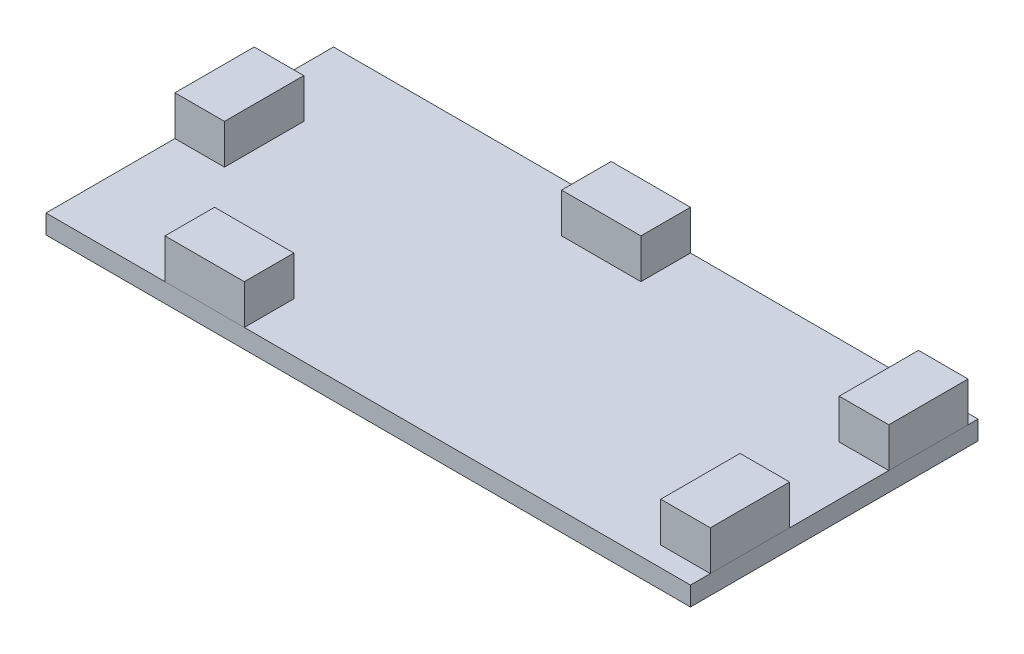
ISO-10303-21;
HEADER;
FILE_DESCRIPTION(('STEP AP214'),'2;1');
FILE_NAME('part.step','',(''),(''),'','','');
FILE_SCHEMA(('AUTOMOTIVE_DESIGN { 1 0 10303 214 1 1 1 1 }'));
ENDSEC;
DATA;
#1=APPLICATION_CONTEXT('core data for automotive mechanical design processes');
#2=APPLICATION_PROTOCOL_DEFINITION('international standard','automotive_design',2000,#1);
#3=PRODUCT_CONTEXT('',#1,'mechanical');
#4=PRODUCT('Part','Part','',(#3));
#5=PRODUCT_RELATED_PRODUCT_CATEGORY('part','',(#4));
#6=PRODUCT_DEFINITION_FORMATION('','',#4);
#7=PRODUCT_DEFINITION_CONTEXT('part definition',#1,'design');
#8=PRODUCT_DEFINITION('design','',#6,#7);
#9=PRODUCT_DEFINITION_SHAPE('','',#8);
#10=(LENGTH_UNIT() NAMED_UNIT(*) SI_UNIT(.MILLI.,.METRE.));
#11=(NAMED_UNIT(*) PLANE_ANGLE_UNIT() SI_UNIT($,.RADIAN.));
#12=(NAMED_UNIT(*) SI_UNIT($,.STERADIAN.) SOLID_ANGLE_UNIT());
#13=UNCERTAINTY_MEASURE_WITH_UNIT(LENGTH_MEASURE(1.E-05),#10,'distance_accuracy_value','');
#14=(GEOMETRIC_REPRESENTATION_CONTEXT(3) GLOBAL_UNCERTAINTY_ASSIGNED_CONTEXT((#13)) GLOBAL_UNIT_ASSIGNED_CONTEXT((#10,
#11,#12)) REPRESENTATION_CONTEXT('',''));
#15=CARTESIAN_POINT('',(0.,0.,0.));
#16=DIRECTION('',(0.,0.,1.));
#17=DIRECTION('',(1.,0.,0.));
#18=AXIS2_PLACEMENT_3D('',#15,#16,#17);
#19=CARTESIAN_POINT('',(-16.271875,4.699,11.509375));
#20=DIRECTION('',(1.,0.,0.));
#21=DIRECTION('',(0.,0.,-1.));
#22=AXIS2_PLACEMENT_3D('',#19,#20,#21);
#23=PLANE('',#22);
#24=DIRECTION('',(0.,0.,1.));
#25=VECTOR('',#24,1.);
#26=CARTESIAN_POINT('',(-16.271875,1.524,11.509375));
#27=LINE('',#26,#25);
#28=CARTESIAN_POINT('',(-16.271875,1.524,7.540625));
#29=VERTEX_POINT('',#28);
#30=CARTESIAN_POINT('',(-16.271875,1.524,11.509375));
#31=VERTEX_POINT('',#30);
#32=EDGE_CURVE('E106',#29,#31,#27,.T.);
#33=ORIENTED_EDGE('',*,*,#32,.T.);
#34=DIRECTION('',(0.,-1.,0.));
#35=VECTOR('',#34,1.);
#36=CARTESIAN_POINT('',(-16.271875,4.699,11.509375));
#37=LINE('',#36,#35);
#38=CARTESIAN_POINT('',(-16.271875,4.699,11.509375));
#39=VERTEX_POINT('',#38);
#40=EDGE_CURVE('E12',#39,#31,#37,.T.);
#41=ORIENTED_EDGE('',*,*,#40,.F.);
#42=DIRECTION('',(0.,0.,1.));
#43=VECTOR('',#42,1.);
#44=CARTESIAN_POINT('',(-16.271875,4.699,11.509375));
#45=LINE('',#44,#43);
#46=CARTESIAN_POINT('',(-16.271875,4.699,7.540625));
#47=VERTEX_POINT('',#46);
#48=EDGE_CURVE('E94',#47,#39,#45,.T.);
#49=ORIENTED_EDGE('',*,*,#48,.F.);
#50=DIRECTION('',(0.,-1.,0.));
#51=VECTOR('',#50,1.);
#52=CARTESIAN_POINT('',(-16.271875,4.699,7.540625));
#53=LINE('',#52,#51);
#54=EDGE_CURVE('E102',#47,#29,#53,.T.);
#55=ORIENTED_EDGE('',*,*,#54,.T.);
#56=EDGE_LOOP('',(#33,#41,#49,#55));
#57=FACE_BOUND('',#56,.T.);
#58=ADVANCED_FACE('F43',(#57),#23,.F.);
#59=CARTESIAN_POINT('',(-16.271875,4.699,11.509375));
#60=DIRECTION('',(0.,0.,-1.));
#61=DIRECTION('',(-1.,0.,0.));
#62=AXIS2_PLACEMENT_3D('',#59,#60,#61);
#63=PLANE('',#62);
#64=DIRECTION('',(1.,0.,0.));
#65=VECTOR('',#64,1.);
#66=CARTESIAN_POINT('',(-16.271875,1.524,11.509375));
#67=LINE('',#66,#65);
#68=CARTESIAN_POINT('',(-9.921875,1.524,11.509375));
#69=VERTEX_POINT('',#68);
#70=EDGE_CURVE('E98',#31,#69,#67,.T.);
#71=ORIENTED_EDGE('',*,*,#70,.T.);
#72=DIRECTION('',(0.,-1.,0.));
#73=VECTOR('',#72,1.);
#74=CARTESIAN_POINT('',(-9.921875,4.699,11.509375));
#75=LINE('',#74,#73);
#76=CARTESIAN_POINT('',(-9.921875,4.699,11.509375));
#77=VERTEX_POINT('',#76);
#78=EDGE_CURVE('E51',#77,#69,#75,.T.);
#79=ORIENTED_EDGE('',*,*,#78,.F.);
#80=DIRECTION('',(1.,0.,0.));
#81=VECTOR('',#80,1.);
#82=CARTESIAN_POINT('',(-16.271875,4.699,11.509375));
#83=LINE('',#82,#81);
#84=EDGE_CURVE('E89',#39,#77,#83,.T.);
#85=ORIENTED_EDGE('',*,*,#84,.F.);
#86=ORIENTED_EDGE('',*,*,#40,.T.);
#87=EDGE_LOOP('',(#71,#79,#85,#86));
#88=FACE_BOUND('',#87,.T.);
#89=ADVANCED_FACE('F97',(#88),#63,.F.);
#90=CARTESIAN_POINT('',(-9.921875,4.699,11.509375));
#91=DIRECTION('',(-1.,0.,0.));
#92=DIRECTION('',(0.,0.,1.));
#93=AXIS2_PLACEMENT_3D('',#90,#91,#92);
#94=PLANE('',#93);
#95=DIRECTION('',(0.,0.,-1.));
#96=VECTOR('',#95,1.);
#97=CARTESIAN_POINT('',(-9.921875,1.524,11.509375));
#98=LINE('',#97,#96);
#99=CARTESIAN_POINT('',(-9.921875,1.524,7.540625));
#100=VERTEX_POINT('',#99);
#101=EDGE_CURVE('E76',#69,#100,#98,.T.);
#102=ORIENTED_EDGE('',*,*,#101,.T.);
#103=DIRECTION('',(0.,-1.,0.));
#104=VECTOR('',#103,1.);
#105=CARTESIAN_POINT('',(-9.921875,4.699,7.540625));
#106=LINE('',#105,#104);
#107=CARTESIAN_POINT('',(-9.921875,4.699,7.540625));
#108=VERTEX_POINT('',#107);
#109=EDGE_CURVE('E99',#108,#100,#106,.T.);
#110=ORIENTED_EDGE('',*,*,#109,.F.);
#111=DIRECTION('',(0.,0.,-1.));
#112=VECTOR('',#111,1.);
#113=CARTESIAN_POINT('',(-9.921875,4.699,11.509375));
#114=LINE('',#113,#112);
#115=EDGE_CURVE('E92',#77,#108,#114,.T.);
#116=ORIENTED_EDGE('',*,*,#115,.F.);
#117=ORIENTED_EDGE('',*,*,#78,.T.);
#118=EDGE_LOOP('',(#102,#110,#116,#117));
#119=FACE_BOUND('',#118,.T.);
#120=ADVANCED_FACE('F100',(#119),#94,.F.);
#121=CARTESIAN_POINT('',(-16.271875,4.699,7.540625));
#122=DIRECTION('',(0.,0.,1.));
#123=DIRECTION('',(1.,0.,0.));
#124=AXIS2_PLACEMENT_3D('',#121,#122,#123);
#125=PLANE('',#124);
#126=DIRECTION('',(-1.,0.,0.));
#127=VECTOR('',#126,1.);
#128=CARTESIAN_POINT('',(-16.271875,1.524,7.540625));
#129=LINE('',#128,#127);
#130=EDGE_CURVE('E82',#100,#29,#129,.T.);
#131=ORIENTED_EDGE('',*,*,#130,.T.);
#132=ORIENTED_EDGE('',*,*,#54,.F.);
#133=DIRECTION('',(-1.,0.,0.));
#134=VECTOR('',#133,1.);
#135=CARTESIAN_POINT('',(-16.271875,4.699,7.540625));
#136=LINE('',#135,#134);
#137=EDGE_CURVE('E59',#108,#47,#136,.T.);
#138=ORIENTED_EDGE('',*,*,#137,.F.);
#139=ORIENTED_EDGE('',*,*,#109,.T.);
#140=EDGE_LOOP('',(#131,#132,#138,#139));
#141=FACE_BOUND('',#140,.T.);
#142=ADVANCED_FACE('F113',(#141),#125,.F.);
#143=CARTESIAN_POINT('',(-16.271875,4.699,7.540625));
#144=DIRECTION('',(0.,-1.,0.));
#145=DIRECTION('',(0.,0.,-1.));
#146=AXIS2_PLACEMENT_3D('',#143,#144,#145);
#147=PLANE('',#146);
#148=ORIENTED_EDGE('',*,*,#48,.T.);
#149=ORIENTED_EDGE('',*,*,#84,.T.);
#150=ORIENTED_EDGE('',*,*,#115,.T.);
#151=ORIENTED_EDGE('',*,*,#137,.T.);
#152=EDGE_LOOP('',(#148,#149,#150,#151));
#153=FACE_BOUND('',#152,.T.);
#154=ADVANCED_FACE('F90',(#153),#147,.F.);
#155=CARTESIAN_POINT('',(-16.271875,1.524,7.540625));
#156=DIRECTION('',(0.,-1.,0.));
#157=DIRECTION('',(0.,0.,-1.));
#158=AXIS2_PLACEMENT_3D('',#155,#156,#157);
#159=PLANE('',#158);
#160=ORIENTED_EDGE('',*,*,#32,.F.);
#161=ORIENTED_EDGE('',*,*,#130,.F.);
#162=ORIENTED_EDGE('',*,*,#101,.F.);
#163=ORIENTED_EDGE('',*,*,#70,.F.);
#164=EDGE_LOOP('',(#160,#161,#162,#163));
#165=FACE_BOUND('',#164,.T.);
#166=ADVANCED_FACE('F116',(#165),#159,.T.);
#167=CLOSED_SHELL('',(#58,#89,#120,#142,#154,#166));
#168=MANIFOLD_SOLID_BREP('B2',#167);
#169=CARTESIAN_POINT('',(-25.796875,4.699,-5.159375));
#170=DIRECTION('',(1.,0.,0.));
#171=DIRECTION('',(0.,0.,-1.));
#172=AXIS2_PLACEMENT_3D('',#169,#170,#171);
#173=PLANE('',#172);
#174=DIRECTION('',(0.,0.,1.));
#175=VECTOR('',#174,1.);
#176=CARTESIAN_POINT('',(-25.796875,1.524,-5.159375));
#177=LINE('',#176,#175);
#178=CARTESIAN_POINT('',(-25.796875,1.524,-5.159375));
#179=VERTEX_POINT('',#178);
#180=CARTESIAN_POINT('',(-25.796875,1.524,1.190625));
#181=VERTEX_POINT('',#180);
#182=EDGE_CURVE('E239',#179,#181,#177,.T.);
#183=ORIENTED_EDGE('',*,*,#182,.T.);
#184=DIRECTION('',(0.,-1.,0.));
#185=VECTOR('',#184,1.);
#186=CARTESIAN_POINT('',(-25.796875,4.699,1.190625));
#187=LINE('',#186,#185);
#188=CARTESIAN_POINT('',(-25.796875,4.699,1.190625));
#189=VERTEX_POINT('',#188);
#190=EDGE_CURVE('E41',#189,#181,#187,.T.);
#191=ORIENTED_EDGE('',*,*,#190,.F.);
#192=DIRECTION('',(0.,0.,1.));
#193=VECTOR('',#192,1.);
#194=CARTESIAN_POINT('',(-25.796875,4.699,-5.159375));
#195=LINE('',#194,#193);
#196=CARTESIAN_POINT('',(-25.796875,4.699,-5.159375));
#197=VERTEX_POINT('',#196);
#198=EDGE_CURVE('E227',#197,#189,#195,.T.);
#199=ORIENTED_EDGE('',*,*,#198,.F.);
#200=DIRECTION('',(0.,-1.,0.));
#201=VECTOR('',#200,1.);
#202=CARTESIAN_POINT('',(-25.796875,4.699,-5.159375));
#203=LINE('',#202,#201);
#204=EDGE_CURVE('E235',#197,#179,#203,.T.);
#205=ORIENTED_EDGE('',*,*,#204,.T.);
#206=EDGE_LOOP('',(#183,#191,#199,#205));
#207=FACE_BOUND('',#206,.T.);
#208=ADVANCED_FACE('F176',(#207),#173,.F.);
#209=CARTESIAN_POINT('',(-25.796875,4.699,1.190625));
#210=DIRECTION('',(0.,0.,-1.));
#211=DIRECTION('',(-1.,0.,0.));
#212=AXIS2_PLACEMENT_3D('',#209,#210,#211);
#213=PLANE('',#212);
#214=DIRECTION('',(1.,0.,0.));
#215=VECTOR('',#214,1.);
#216=CARTESIAN_POINT('',(-25.796875,1.524,1.190625));
#217=LINE('',#216,#215);
#218=CARTESIAN_POINT('',(-21.828125,1.524,1.190625));
#219=VERTEX_POINT('',#218);
#220=EDGE_CURVE('E231',#181,#219,#217,.T.);
#221=ORIENTED_EDGE('',*,*,#220,.T.);
#222=DIRECTION('',(0.,-1.,0.));
#223=VECTOR('',#222,1.);
#224=CARTESIAN_POINT('',(-21.828125,4.699,1.190625));
#225=LINE('',#224,#223);
#226=CARTESIAN_POINT('',(-21.828125,4.699,1.190625));
#227=VERTEX_POINT('',#226);
#228=EDGE_CURVE('E184',#227,#219,#225,.T.);
#229=ORIENTED_EDGE('',*,*,#228,.F.);
#230=DIRECTION('',(1.,0.,0.));
#231=VECTOR('',#230,1.);
#232=CARTESIAN_POINT('',(-25.796875,4.699,1.190625));
#233=LINE('',#232,#231);
#234=EDGE_CURVE('E222',#189,#227,#233,.T.);
#235=ORIENTED_EDGE('',*,*,#234,.F.);
#236=ORIENTED_EDGE('',*,*,#190,.T.);
#237=EDGE_LOOP('',(#221,#229,#235,#236));
#238=FACE_BOUND('',#237,.T.);
#239=ADVANCED_FACE('F230',(#238),#213,.F.);
#240=CARTESIAN_POINT('',(-21.828125,4.699,-5.159375));
#241=DIRECTION('',(-1.,0.,0.));
#242=DIRECTION('',(0.,0.,1.));
#243=AXIS2_PLACEMENT_3D('',#240,#241,#242);
#244=PLANE('',#243);
#245=DIRECTION('',(0.,0.,-1.));
#246=VECTOR('',#245,1.);
#247=CARTESIAN_POINT('',(-21.828125,1.524,-5.159375));
#248=LINE('',#247,#246);
#249=CARTESIAN_POINT('',(-21.828125,1.524,-5.159375));
#250=VERTEX_POINT('',#249);
#251=EDGE_CURVE('E209',#219,#250,#248,.T.);
#252=ORIENTED_EDGE('',*,*,#251,.T.);
#253=DIRECTION('',(0.,-1.,0.));
#254=VECTOR('',#253,1.);
#255=CARTESIAN_POINT('',(-21.828125,4.699,-5.159375));
#256=LINE('',#255,#254);
#257=CARTESIAN_POINT('',(-21.828125,4.699,-5.159375));
#258=VERTEX_POINT('',#257);
#259=EDGE_CURVE('E232',#258,#250,#256,.T.);
#260=ORIENTED_EDGE('',*,*,#259,.F.);
#261=DIRECTION('',(0.,0.,-1.));
#262=VECTOR('',#261,1.);
#263=CARTESIAN_POINT('',(-21.828125,4.699,-5.159375));
#264=LINE('',#263,#262);
#265=EDGE_CURVE('E225',#227,#258,#264,.T.);
#266=ORIENTED_EDGE('',*,*,#265,.F.);
#267=ORIENTED_EDGE('',*,*,#228,.T.);
#268=EDGE_LOOP('',(#252,#260,#266,#267));
#269=FACE_BOUND('',#268,.T.);
#270=ADVANCED_FACE('F233',(#269),#244,.F.);
#271=CARTESIAN_POINT('',(-25.796875,4.699,-5.159375));
#272=DIRECTION('',(0.,0.,1.));
#273=DIRECTION('',(1.,0.,0.));
#274=AXIS2_PLACEMENT_3D('',#271,#272,#273);
#275=PLANE('',#274);
#276=DIRECTION('',(-1.,0.,0.));
#277=VECTOR('',#276,1.);
#278=CARTESIAN_POINT('',(-25.796875,1.524,-5.159375));
#279=LINE('',#278,#277);
#280=EDGE_CURVE('E215',#250,#179,#279,.T.);
#281=ORIENTED_EDGE('',*,*,#280,.T.);
#282=ORIENTED_EDGE('',*,*,#204,.F.);
#283=DIRECTION('',(-1.,0.,0.));
#284=VECTOR('',#283,1.);
#285=CARTESIAN_POINT('',(-25.796875,4.699,-5.159375));
#286=LINE('',#285,#284);
#287=EDGE_CURVE('E192',#258,#197,#286,.T.);
#288=ORIENTED_EDGE('',*,*,#287,.F.);
#289=ORIENTED_EDGE('',*,*,#259,.T.);
#290=EDGE_LOOP('',(#281,#282,#288,#289));
#291=FACE_BOUND('',#290,.T.);
#292=ADVANCED_FACE('F246',(#291),#275,.F.);
#293=CARTESIAN_POINT('',(-25.796875,4.699,1.190625));
#294=DIRECTION('',(0.,1.,0.));
#295=DIRECTION('',(0.,0.,1.));
#296=AXIS2_PLACEMENT_3D('',#293,#294,#295);
#297=PLANE('',#296);
#298=ORIENTED_EDGE('',*,*,#198,.T.);
#299=ORIENTED_EDGE('',*,*,#234,.T.);
#300=ORIENTED_EDGE('',*,*,#265,.T.);
#301=ORIENTED_EDGE('',*,*,#287,.T.);
#302=EDGE_LOOP('',(#298,#299,#300,#301));
#303=FACE_BOUND('',#302,.T.);
#304=ADVANCED_FACE('F223',(#303),#297,.T.);
#305=CARTESIAN_POINT('',(-25.796875,1.524,1.190625));
#306=DIRECTION('',(0.,1.,0.));
#307=DIRECTION('',(0.,0.,1.));
#308=AXIS2_PLACEMENT_3D('',#305,#306,#307);
#309=PLANE('',#308);
#310=ORIENTED_EDGE('',*,*,#182,.F.);
#311=ORIENTED_EDGE('',*,*,#280,.F.);
#312=ORIENTED_EDGE('',*,*,#251,.F.);
#313=ORIENTED_EDGE('',*,*,#220,.F.);
#314=EDGE_LOOP('',(#310,#311,#312,#313));
#315=FACE_BOUND('',#314,.T.);
#316=ADVANCED_FACE('F249',(#315),#309,.F.);
#317=CLOSED_SHELL('',(#208,#239,#270,#292,#304,#316));
#318=MANIFOLD_SOLID_BREP('B6',#317);
#319=CARTESIAN_POINT('',(-3.57187500000001,4.699,-11.509375));
#320=DIRECTION('',(1.,0.,0.));
#321=DIRECTION('',(0.,0.,-1.));
#322=AXIS2_PLACEMENT_3D('',#319,#320,#321);
#323=PLANE('',#322);
#324=DIRECTION('',(0.,0.,1.));
#325=VECTOR('',#324,1.);
#326=CARTESIAN_POINT('',(-3.57187500000001,1.524,-11.509375));
#327=LINE('',#326,#325);
#328=CARTESIAN_POINT('',(-3.57187500000001,1.524,-11.509375));
#329=VERTEX_POINT('',#328);
#330=CARTESIAN_POINT('',(-3.57187500000001,1.524,-7.540625));
#331=VERTEX_POINT('',#330);
#332=EDGE_CURVE('E372',#329,#331,#327,.T.);
#333=ORIENTED_EDGE('',*,*,#332,.T.);
#334=DIRECTION('',(0.,-1.,0.));
#335=VECTOR('',#334,1.);
#336=CARTESIAN_POINT('',(-3.57187500000001,4.699,-7.540625));
#337=LINE('',#336,#335);
#338=CARTESIAN_POINT('',(-3.57187500000001,4.699,-7.540625));
#339=VERTEX_POINT('',#338);
#340=EDGE_CURVE('E174',#339,#331,#337,.T.);
#341=ORIENTED_EDGE('',*,*,#340,.F.);
#342=DIRECTION('',(0.,0.,1.));
#343=VECTOR('',#342,1.);
#344=CARTESIAN_POINT('',(-3.57187500000001,4.699,-11.509375));
#345=LINE('',#344,#343);
#346=CARTESIAN_POINT('',(-3.57187500000001,4.699,-11.509375));
#347=VERTEX_POINT('',#346);
#348=EDGE_CURVE('E360',#347,#339,#345,.T.);
#349=ORIENTED_EDGE('',*,*,#348,.F.);
#350=DIRECTION('',(0.,-1.,0.));
#351=VECTOR('',#350,1.);
#352=CARTESIAN_POINT('',(-3.57187500000001,4.699,-11.509375));
#353=LINE('',#352,#351);
#354=EDGE_CURVE('E368',#347,#329,#353,.T.);
#355=ORIENTED_EDGE('',*,*,#354,.T.);
#356=EDGE_LOOP('',(#333,#341,#349,#355));
#357=FACE_BOUND('',#356,.T.);
#358=ADVANCED_FACE('F309',(#357),#323,.F.);
#359=CARTESIAN_POINT('',(-3.57187500000001,4.699,-7.540625));
#360=DIRECTION('',(0.,0.,-1.));
#361=DIRECTION('',(-1.,0.,0.));
#362=AXIS2_PLACEMENT_3D('',#359,#360,#361);
#363=PLANE('',#362);
#364=DIRECTION('',(1.,0.,0.));
#365=VECTOR('',#364,1.);
#366=CARTESIAN_POINT('',(-3.57187500000001,1.524,-7.540625));
#367=LINE('',#366,#365);
#368=CARTESIAN_POINT('',(2.77812499999999,1.524,-7.540625));
#369=VERTEX_POINT('',#368);
#370=EDGE_CURVE('E364',#331,#369,#367,.T.);
#371=ORIENTED_EDGE('',*,*,#370,.T.);
#372=DIRECTION('',(0.,-1.,0.));
#373=VECTOR('',#372,1.);
#374=CARTESIAN_POINT('',(2.77812499999999,4.699,-7.540625));
#375=LINE('',#374,#373);
#376=CARTESIAN_POINT('',(2.77812499999999,4.699,-7.540625));
#377=VERTEX_POINT('',#376);
#378=EDGE_CURVE('E317',#377,#369,#375,.T.);
#379=ORIENTED_EDGE('',*,*,#378,.F.);
#380=DIRECTION('',(1.,0.,0.));
#381=VECTOR('',#380,1.);
#382=CARTESIAN_POINT('',(-3.57187500000001,4.699,-7.540625));
#383=LINE('',#382,#381);
#384=EDGE_CURVE('E355',#339,#377,#383,.T.);
#385=ORIENTED_EDGE('',*,*,#384,.F.);
#386=ORIENTED_EDGE('',*,*,#340,.T.);
#387=EDGE_LOOP('',(#371,#379,#385,#386));
#388=FACE_BOUND('',#387,.T.);
#389=ADVANCED_FACE('F363',(#388),#363,.F.);
#390=CARTESIAN_POINT('',(2.77812499999999,4.699,-11.509375));
#391=DIRECTION('',(-1.,0.,0.));
#392=DIRECTION('',(0.,0.,1.));
#393=AXIS2_PLACEMENT_3D('',#390,#391,#392);
#394=PLANE('',#393);
#395=DIRECTION('',(0.,0.,-1.));
#396=VECTOR('',#395,1.);
#397=CARTESIAN_POINT('',(2.77812499999999,1.524,-11.509375));
#398=LINE('',#397,#396);
#399=CARTESIAN_POINT('',(2.77812499999999,1.524,-11.509375));
#400=VERTEX_POINT('',#399);
#401=EDGE_CURVE('E342',#369,#400,#398,.T.);
#402=ORIENTED_EDGE('',*,*,#401,.T.);
#403=DIRECTION('',(0.,-1.,0.));
#404=VECTOR('',#403,1.);
#405=CARTESIAN_POINT('',(2.77812499999999,4.699,-11.509375));
#406=LINE('',#405,#404);
#407=CARTESIAN_POINT('',(2.77812499999999,4.699,-11.509375));
#408=VERTEX_POINT('',#407);
#409=EDGE_CURVE('E365',#408,#400,#406,.T.);
#410=ORIENTED_EDGE('',*,*,#409,.F.);
#411=DIRECTION('',(0.,0.,-1.));
#412=VECTOR('',#411,1.);
#413=CARTESIAN_POINT('',(2.77812499999999,4.699,-11.509375));
#414=LINE('',#413,#412);
#415=EDGE_CURVE('E358',#377,#408,#414,.T.);
#416=ORIENTED_EDGE('',*,*,#415,.F.);
#417=ORIENTED_EDGE('',*,*,#378,.T.);
#418=EDGE_LOOP('',(#402,#410,#416,#417));
#419=FACE_BOUND('',#418,.T.);
#420=ADVANCED_FACE('F366',(#419),#394,.F.);
#421=CARTESIAN_POINT('',(-3.57187500000001,4.699,-11.509375));
#422=DIRECTION('',(0.,0.,1.));
#423=DIRECTION('',(1.,0.,0.));
#424=AXIS2_PLACEMENT_3D('',#421,#422,#423);
#425=PLANE('',#424);
#426=DIRECTION('',(-1.,0.,0.));
#427=VECTOR('',#426,1.);
#428=CARTESIAN_POINT('',(-3.57187500000001,1.524,-11.509375));
#429=LINE('',#428,#427);
#430=EDGE_CURVE('E348',#400,#329,#429,.T.);
#431=ORIENTED_EDGE('',*,*,#430,.T.);
#432=ORIENTED_EDGE('',*,*,#354,.F.);
#433=DIRECTION('',(-1.,0.,0.));
#434=VECTOR('',#433,1.);
#435=CARTESIAN_POINT('',(-3.57187500000001,4.699,-11.509375));
#436=LINE('',#435,#434);
#437=EDGE_CURVE('E325',#408,#347,#436,.T.);
#438=ORIENTED_EDGE('',*,*,#437,.F.);
#439=ORIENTED_EDGE('',*,*,#409,.T.);
#440=EDGE_LOOP('',(#431,#432,#438,#439));
#441=FACE_BOUND('',#440,.T.);
#442=ADVANCED_FACE('F379',(#441),#425,.F.);
#443=CARTESIAN_POINT('',(-3.57187500000001,4.699,-7.540625));
#444=DIRECTION('',(0.,1.,0.));
#445=DIRECTION('',(0.,0.,1.));
#446=AXIS2_PLACEMENT_3D('',#443,#444,#445);
#447=PLANE('',#446);
#448=ORIENTED_EDGE('',*,*,#348,.T.);
#449=ORIENTED_EDGE('',*,*,#384,.T.);
#450=ORIENTED_EDGE('',*,*,#415,.T.);
#451=ORIENTED_EDGE('',*,*,#437,.T.);
#452=EDGE_LOOP('',(#448,#449,#450,#451));
#453=FACE_BOUND('',#452,.T.);
#454=ADVANCED_FACE('F356',(#453),#447,.T.);
#455=CARTESIAN_POINT('',(-3.57187500000001,1.524,-7.540625));
#456=DIRECTION('',(0.,1.,0.));
#457=DIRECTION('',(0.,0.,1.));
#458=AXIS2_PLACEMENT_3D('',#455,#456,#457);
#459=PLANE('',#458);
#460=ORIENTED_EDGE('',*,*,#332,.F.);
#461=ORIENTED_EDGE('',*,*,#430,.F.);
#462=ORIENTED_EDGE('',*,*,#401,.F.);
#463=ORIENTED_EDGE('',*,*,#370,.F.);
#464=EDGE_LOOP('',(#460,#461,#462,#463));
#465=FACE_BOUND('',#464,.T.);
#466=ADVANCED_FACE('F382',(#465),#459,.F.);
#467=CLOSED_SHELL('',(#358,#389,#420,#442,#454,#466));
#468=MANIFOLD_SOLID_BREP('B35',#467);
#469=CARTESIAN_POINT('',(25.796875,4.699,-10.715625));
#470=DIRECTION('',(-1.,0.,0.));
#471=DIRECTION('',(0.,0.,1.));
#472=AXIS2_PLACEMENT_3D('',#469,#470,#471);
#473=PLANE('',#472);
#474=DIRECTION('',(0.,0.,-1.));
#475=VECTOR('',#474,1.);
#476=CARTESIAN_POINT('',(25.796875,1.524,-10.715625));
#477=LINE('',#476,#475);
#478=CARTESIAN_POINT('',(25.796875,1.524,-4.365625));
#479=VERTEX_POINT('',#478);
#480=CARTESIAN_POINT('',(25.796875,1.524,-10.715625));
#481=VERTEX_POINT('',#480);
#482=EDGE_CURVE('E505',#479,#481,#477,.T.);
#483=ORIENTED_EDGE('',*,*,#482,.T.);
#484=DIRECTION('',(0.,-1.,0.));
#485=VECTOR('',#484,1.);
#486=CARTESIAN_POINT('',(25.796875,4.699,-10.715625));
#487=LINE('',#486,#485);
#488=CARTESIAN_POINT('',(25.796875,4.699,-10.715625));
#489=VERTEX_POINT('',#488);
#490=EDGE_CURVE('E307',#489,#481,#487,.T.);
#491=ORIENTED_EDGE('',*,*,#490,.F.);
#492=DIRECTION('',(0.,0.,-1.));
#493=VECTOR('',#492,1.);
#494=CARTESIAN_POINT('',(25.796875,4.699,-10.715625));
#495=LINE('',#494,#493);
#496=CARTESIAN_POINT('',(25.796875,4.699,-4.365625));
#497=VERTEX_POINT('',#496);
#498=EDGE_CURVE('E493',#497,#489,#495,.T.);
#499=ORIENTED_EDGE('',*,*,#498,.F.);
#500=DIRECTION('',(0.,-1.,0.));
#501=VECTOR('',#500,1.);
#502=CARTESIAN_POINT('',(25.796875,4.699,-4.365625));
#503=LINE('',#502,#501);
#504=EDGE_CURVE('E501',#497,#479,#503,.T.);
#505=ORIENTED_EDGE('',*,*,#504,.T.);
#506=EDGE_LOOP('',(#483,#491,#499,#505));
#507=FACE_BOUND('',#506,.T.);
#508=ADVANCED_FACE('F442',(#507),#473,.F.);
#509=CARTESIAN_POINT('',(25.796875,4.699,-10.715625));
#510=DIRECTION('',(0.,0.,1.));
#511=DIRECTION('',(1.,0.,0.));
#512=AXIS2_PLACEMENT_3D('',#509,#510,#511);
#513=PLANE('',#512);
#514=DIRECTION('',(-1.,0.,0.));
#515=VECTOR('',#514,1.);
#516=CARTESIAN_POINT('',(25.796875,1.524,-10.715625));
#517=LINE('',#516,#515);
#518=CARTESIAN_POINT('',(21.828125,1.524,-10.715625));
#519=VERTEX_POINT('',#518);
#520=EDGE_CURVE('E497',#481,#519,#517,.T.);
#521=ORIENTED_EDGE('',*,*,#520,.T.);
#522=DIRECTION('',(0.,-1.,0.));
#523=VECTOR('',#522,1.);
#524=CARTESIAN_POINT('',(21.828125,4.699,-10.715625));
#525=LINE('',#524,#523);
#526=CARTESIAN_POINT('',(21.828125,4.699,-10.715625));
#527=VERTEX_POINT('',#526);
#528=EDGE_CURVE('E450',#527,#519,#525,.T.);
#529=ORIENTED_EDGE('',*,*,#528,.F.);
#530=DIRECTION('',(-1.,0.,0.));
#531=VECTOR('',#530,1.);
#532=CARTESIAN_POINT('',(25.796875,4.699,-10.715625));
#533=LINE('',#532,#531);
#534=EDGE_CURVE('E488',#489,#527,#533,.T.);
#535=ORIENTED_EDGE('',*,*,#534,.F.);
#536=ORIENTED_EDGE('',*,*,#490,.T.);
#537=EDGE_LOOP('',(#521,#529,#535,#536));
#538=FACE_BOUND('',#537,.T.);
#539=ADVANCED_FACE('F496',(#538),#513,.F.);
#540=CARTESIAN_POINT('',(21.828125,4.699,-10.715625));
#541=DIRECTION('',(1.,0.,0.));
#542=DIRECTION('',(0.,0.,-1.));
#543=AXIS2_PLACEMENT_3D('',#540,#541,#542);
#544=PLANE('',#543);
#545=DIRECTION('',(0.,0.,1.));
#546=VECTOR('',#545,1.);
#547=CARTESIAN_POINT('',(21.828125,1.524,-10.715625));
#548=LINE('',#547,#546);
#549=CARTESIAN_POINT('',(21.828125,1.524,-4.365625));
#550=VERTEX_POINT('',#549);
#551=EDGE_CURVE('E475',#519,#550,#548,.T.);
#552=ORIENTED_EDGE('',*,*,#551,.T.);
#553=DIRECTION('',(0.,-1.,0.));
#554=VECTOR('',#553,1.);
#555=CARTESIAN_POINT('',(21.828125,4.699,-4.365625));
#556=LINE('',#555,#554);
#557=CARTESIAN_POINT('',(21.828125,4.699,-4.365625));
#558=VERTEX_POINT('',#557);
#559=EDGE_CURVE('E498',#558,#550,#556,.T.);
#560=ORIENTED_EDGE('',*,*,#559,.F.);
#561=DIRECTION('',(0.,0.,1.));
#562=VECTOR('',#561,1.);
#563=CARTESIAN_POINT('',(21.828125,4.699,-10.715625));
#564=LINE('',#563,#562);
#565=EDGE_CURVE('E491',#527,#558,#564,.T.);
#566=ORIENTED_EDGE('',*,*,#565,.F.);
#567=ORIENTED_EDGE('',*,*,#528,.T.);
#568=EDGE_LOOP('',(#552,#560,#566,#567));
#569=FACE_BOUND('',#568,.T.);
#570=ADVANCED_FACE('F499',(#569),#544,.F.);
#571=CARTESIAN_POINT('',(25.796875,4.699,-4.365625));
#572=DIRECTION('',(0.,0.,-1.));
#573=DIRECTION('',(-1.,0.,0.));
#574=AXIS2_PLACEMENT_3D('',#571,#572,#573);
#575=PLANE('',#574);
#576=DIRECTION('',(1.,0.,0.));
#577=VECTOR('',#576,1.);
#578=CARTESIAN_POINT('',(25.796875,1.524,-4.365625));
#579=LINE('',#578,#577);
#580=EDGE_CURVE('E481',#550,#479,#579,.T.);
#581=ORIENTED_EDGE('',*,*,#580,.T.);
#582=ORIENTED_EDGE('',*,*,#504,.F.);
#583=DIRECTION('',(1.,0.,0.));
#584=VECTOR('',#583,1.);
#585=CARTESIAN_POINT('',(25.796875,4.699,-4.365625));
#586=LINE('',#585,#584);
#587=EDGE_CURVE('E458',#558,#497,#586,.T.);
#588=ORIENTED_EDGE('',*,*,#587,.F.);
#589=ORIENTED_EDGE('',*,*,#559,.T.);
#590=EDGE_LOOP('',(#581,#582,#588,#589));
#591=FACE_BOUND('',#590,.T.);
#592=ADVANCED_FACE('F512',(#591),#575,.F.);
#593=CARTESIAN_POINT('',(25.796875,4.699,-4.365625));
#594=DIRECTION('',(0.,-1.,0.));
#595=DIRECTION('',(0.,0.,-1.));
#596=AXIS2_PLACEMENT_3D('',#593,#594,#595);
#597=PLANE('',#596);
#598=ORIENTED_EDGE('',*,*,#498,.T.);
#599=ORIENTED_EDGE('',*,*,#534,.T.);
#600=ORIENTED_EDGE('',*,*,#565,.T.);
#601=ORIENTED_EDGE('',*,*,#587,.T.);
#602=EDGE_LOOP('',(#598,#599,#600,#601));
#603=FACE_BOUND('',#602,.T.);
#604=ADVANCED_FACE('F489',(#603),#597,.F.);
#605=CARTESIAN_POINT('',(25.796875,1.524,-4.365625));
#606=DIRECTION('',(0.,-1.,0.));
#607=DIRECTION('',(0.,0.,-1.));
#608=AXIS2_PLACEMENT_3D('',#605,#606,#607);
#609=PLANE('',#608);
#610=ORIENTED_EDGE('',*,*,#482,.F.);
#611=ORIENTED_EDGE('',*,*,#580,.F.);
#612=ORIENTED_EDGE('',*,*,#551,.F.);
#613=ORIENTED_EDGE('',*,*,#520,.F.);
#614=EDGE_LOOP('',(#610,#611,#612,#613));
#615=FACE_BOUND('',#614,.T.);
#616=ADVANCED_FACE('F515',(#615),#609,.T.);
#617=CLOSED_SHELL('',(#508,#539,#570,#592,#604,#616));
#618=MANIFOLD_SOLID_BREP('B168',#617);
#619=CARTESIAN_POINT('',(25.796875,4.699,9.921875));
#620=DIRECTION('',(-1.,0.,0.));
#621=DIRECTION('',(0.,0.,1.));
#622=AXIS2_PLACEMENT_3D('',#619,#620,#621);
#623=PLANE('',#622);
#624=DIRECTION('',(0.,0.,-1.));
#625=VECTOR('',#624,1.);
#626=CARTESIAN_POINT('',(25.796875,1.524,9.921875));
#627=LINE('',#626,#625);
#628=CARTESIAN_POINT('',(25.796875,1.524,9.921875));
#629=VERTEX_POINT('',#628);
#630=CARTESIAN_POINT('',(25.796875,1.524,3.571875));
#631=VERTEX_POINT('',#630);
#632=EDGE_CURVE('E637',#629,#631,#627,.T.);
#633=ORIENTED_EDGE('',*,*,#632,.T.);
#634=DIRECTION('',(0.,-1.,0.));
#635=VECTOR('',#634,1.);
#636=CARTESIAN_POINT('',(25.796875,4.699,3.571875));
#637=LINE('',#636,#635);
#638=CARTESIAN_POINT('',(25.796875,4.699,3.571875));
#639=VERTEX_POINT('',#638);
#640=EDGE_CURVE('E440',#639,#631,#637,.T.);
#641=ORIENTED_EDGE('',*,*,#640,.F.);
#642=DIRECTION('',(0.,0.,-1.));
#643=VECTOR('',#642,1.);
#644=CARTESIAN_POINT('',(25.796875,4.699,9.921875));
#645=LINE('',#644,#643);
#646=CARTESIAN_POINT('',(25.796875,4.699,9.921875));
#647=VERTEX_POINT('',#646);
#648=EDGE_CURVE('E625',#647,#639,#645,.T.);
#649=ORIENTED_EDGE('',*,*,#648,.F.);
#650=DIRECTION('',(0.,-1.,0.));
#651=VECTOR('',#650,1.);
#652=CARTESIAN_POINT('',(25.796875,4.699,9.921875));
#653=LINE('',#652,#651);
#654=EDGE_CURVE('E633',#647,#629,#653,.T.);
#655=ORIENTED_EDGE('',*,*,#654,.T.);
#656=EDGE_LOOP('',(#633,#641,#649,#655));
#657=FACE_BOUND('',#656,.T.);
#658=ADVANCED_FACE('F574',(#657),#623,.F.);
#659=CARTESIAN_POINT('',(25.796875,4.699,3.571875));
#660=DIRECTION('',(0.,0.,1.));
#661=DIRECTION('',(1.,0.,0.));
#662=AXIS2_PLACEMENT_3D('',#659,#660,#661);
#663=PLANE('',#662);
#664=DIRECTION('',(-1.,0.,0.));
#665=VECTOR('',#664,1.);
#666=CARTESIAN_POINT('',(25.796875,1.524,3.571875));
#667=LINE('',#666,#665);
#668=CARTESIAN_POINT('',(21.828125,1.524,3.571875));
#669=VERTEX_POINT('',#668);
#670=EDGE_CURVE('E629',#631,#669,#667,.T.);
#671=ORIENTED_EDGE('',*,*,#670,.T.);
#672=DIRECTION('',(0.,-1.,0.));
#673=VECTOR('',#672,1.);
#674=CARTESIAN_POINT('',(21.828125,4.699,3.571875));
#675=LINE('',#674,#673);
#676=CARTESIAN_POINT('',(21.828125,4.699,3.571875));
#677=VERTEX_POINT('',#676);
#678=EDGE_CURVE('E582',#677,#669,#675,.T.);
#679=ORIENTED_EDGE('',*,*,#678,.F.);
#680=DIRECTION('',(-1.,0.,0.));
#681=VECTOR('',#680,1.);
#682=CARTESIAN_POINT('',(25.796875,4.699,3.571875));
#683=LINE('',#682,#681);
#684=EDGE_CURVE('E620',#639,#677,#683,.T.);
#685=ORIENTED_EDGE('',*,*,#684,.F.);
#686=ORIENTED_EDGE('',*,*,#640,.T.);
#687=EDGE_LOOP('',(#671,#679,#685,#686));
#688=FACE_BOUND('',#687,.T.);
#689=ADVANCED_FACE('F628',(#688),#663,.F.);
#690=CARTESIAN_POINT('',(21.828125,4.699,9.921875));
#691=DIRECTION('',(1.,0.,0.));
#692=DIRECTION('',(0.,0.,-1.));
#693=AXIS2_PLACEMENT_3D('',#690,#691,#692);
#694=PLANE('',#693);
#695=DIRECTION('',(0.,0.,1.));
#696=VECTOR('',#695,1.);
#697=CARTESIAN_POINT('',(21.828125,1.524,9.921875));
#698=LINE('',#697,#696);
#699=CARTESIAN_POINT('',(21.828125,1.524,9.921875));
#700=VERTEX_POINT('',#699);
#701=EDGE_CURVE('E607',#669,#700,#698,.T.);
#702=ORIENTED_EDGE('',*,*,#701,.T.);
#703=DIRECTION('',(0.,-1.,0.));
#704=VECTOR('',#703,1.);
#705=CARTESIAN_POINT('',(21.828125,4.699,9.921875));
#706=LINE('',#705,#704);
#707=CARTESIAN_POINT('',(21.828125,4.699,9.921875));
#708=VERTEX_POINT('',#707);
#709=EDGE_CURVE('E630',#708,#700,#706,.T.);
#710=ORIENTED_EDGE('',*,*,#709,.F.);
#711=DIRECTION('',(0.,0.,1.));
#712=VECTOR('',#711,1.);
#713=CARTESIAN_POINT('',(21.828125,4.699,9.921875));
#714=LINE('',#713,#712);
#715=EDGE_CURVE('E623',#677,#708,#714,.T.);
#716=ORIENTED_EDGE('',*,*,#715,.F.);
#717=ORIENTED_EDGE('',*,*,#678,.T.);
#718=EDGE_LOOP('',(#702,#710,#716,#717));
#719=FACE_BOUND('',#718,.T.);
#720=ADVANCED_FACE('F631',(#719),#694,.F.);
#721=CARTESIAN_POINT('',(25.796875,4.699,9.921875));
#722=DIRECTION('',(0.,0.,-1.));
#723=DIRECTION('',(-1.,0.,0.));
#724=AXIS2_PLACEMENT_3D('',#721,#722,#723);
#725=PLANE('',#724);
#726=DIRECTION('',(1.,0.,0.));
#727=VECTOR('',#726,1.);
#728=CARTESIAN_POINT('',(25.796875,1.524,9.921875));
#729=LINE('',#728,#727);
#730=EDGE_CURVE('E613',#700,#629,#729,.T.);
#731=ORIENTED_EDGE('',*,*,#730,.T.);
#732=ORIENTED_EDGE('',*,*,#654,.F.);
#733=DIRECTION('',(1.,0.,0.));
#734=VECTOR('',#733,1.);
#735=CARTESIAN_POINT('',(25.796875,4.699,9.921875));
#736=LINE('',#735,#734);
#737=EDGE_CURVE('E590',#708,#647,#736,.T.);
#738=ORIENTED_EDGE('',*,*,#737,.F.);
#739=ORIENTED_EDGE('',*,*,#709,.T.);
#740=EDGE_LOOP('',(#731,#732,#738,#739));
#741=FACE_BOUND('',#740,.T.);
#742=ADVANCED_FACE('F644',(#741),#725,.F.);
#743=CARTESIAN_POINT('',(25.796875,4.699,3.571875));
#744=DIRECTION('',(0.,1.,0.));
#745=DIRECTION('',(0.,0.,1.));
#746=AXIS2_PLACEMENT_3D('',#743,#744,#745);
#747=PLANE('',#746);
#748=ORIENTED_EDGE('',*,*,#648,.T.);
#749=ORIENTED_EDGE('',*,*,#684,.T.);
#750=ORIENTED_EDGE('',*,*,#715,.T.);
#751=ORIENTED_EDGE('',*,*,#737,.T.);
#752=EDGE_LOOP('',(#748,#749,#750,#751));
#753=FACE_BOUND('',#752,.T.);
#754=ADVANCED_FACE('F621',(#753),#747,.T.);
#755=CARTESIAN_POINT('',(25.796875,1.524,3.571875));
#756=DIRECTION('',(0.,1.,0.));
#757=DIRECTION('',(0.,0.,1.));
#758=AXIS2_PLACEMENT_3D('',#755,#756,#757);
#759=PLANE('',#758);
#760=ORIENTED_EDGE('',*,*,#632,.F.);
#761=ORIENTED_EDGE('',*,*,#730,.F.);
#762=ORIENTED_EDGE('',*,*,#701,.F.);
#763=ORIENTED_EDGE('',*,*,#670,.F.);
#764=EDGE_LOOP('',(#760,#761,#762,#763));
#765=FACE_BOUND('',#764,.T.);
#766=ADVANCED_FACE('F647',(#765),#759,.F.);
#767=CLOSED_SHELL('',(#658,#689,#720,#742,#754,#766));
#768=MANIFOLD_SOLID_BREP('B301',#767);
#769=CARTESIAN_POINT('',(25.796875,1.524,11.509375));
#770=DIRECTION('',(-1.,0.,0.));
#771=DIRECTION('',(0.,0.,1.));
#772=AXIS2_PLACEMENT_3D('',#769,#770,#771);
#773=PLANE('',#772);
#774=DIRECTION('',(0.,0.,-1.));
#775=VECTOR('',#774,1.);
#776=CARTESIAN_POINT('',(25.796875,0.,11.509375));
#777=LINE('',#776,#775);
#778=CARTESIAN_POINT('',(25.796875,0.,11.509375));
#779=VERTEX_POINT('',#778);
#780=CARTESIAN_POINT('',(25.796875,0.,-11.509375));
#781=VERTEX_POINT('',#780);
#782=EDGE_CURVE('E760',#779,#781,#777,.T.);
#783=ORIENTED_EDGE('',*,*,#782,.T.);
#784=DIRECTION('',(0.,-1.,0.));
#785=VECTOR('',#784,1.);
#786=CARTESIAN_POINT('',(25.796875,1.524,-11.509375));
#787=LINE('',#786,#785);
#788=CARTESIAN_POINT('',(25.796875,1.524,-11.509375));
#789=VERTEX_POINT('',#788);
#790=EDGE_CURVE('E572',#789,#781,#787,.T.);
#791=ORIENTED_EDGE('',*,*,#790,.F.);
#792=DIRECTION('',(0.,0.,-1.));
#793=VECTOR('',#792,1.);
#794=CARTESIAN_POINT('',(25.796875,1.524,11.509375));
#795=LINE('',#794,#793);
#796=CARTESIAN_POINT('',(25.796875,1.524,11.509375));
#797=VERTEX_POINT('',#796);
#798=EDGE_CURVE('E748',#797,#789,#795,.T.);
#799=ORIENTED_EDGE('',*,*,#798,.F.);
#800=DIRECTION('',(0.,-1.,0.));
#801=VECTOR('',#800,1.);
#802=CARTESIAN_POINT('',(25.796875,1.524,11.509375));
#803=LINE('',#802,#801);
#804=EDGE_CURVE('E756',#797,#779,#803,.T.);
#805=ORIENTED_EDGE('',*,*,#804,.T.);
#806=EDGE_LOOP('',(#783,#791,#799,#805));
#807=FACE_BOUND('',#806,.T.);
#808=ADVANCED_FACE('F697',(#807),#773,.F.);
#809=CARTESIAN_POINT('',(-25.796875,1.524,-11.509375));
#810=DIRECTION('',(0.,0.,1.));
#811=DIRECTION('',(1.,0.,0.));
#812=AXIS2_PLACEMENT_3D('',#809,#810,#811);
#813=PLANE('',#812);
#814=DIRECTION('',(-1.,0.,0.));
#815=VECTOR('',#814,1.);
#816=CARTESIAN_POINT('',(-25.796875,0.,-11.509375));
#817=LINE('',#816,#815);
#818=CARTESIAN_POINT('',(-25.796875,0.,-11.509375));
#819=VERTEX_POINT('',#818);
#820=EDGE_CURVE('E752',#781,#819,#817,.T.);
#821=ORIENTED_EDGE('',*,*,#820,.T.);
#822=DIRECTION('',(0.,-1.,0.));
#823=VECTOR('',#822,1.);
#824=CARTESIAN_POINT('',(-25.796875,1.524,-11.509375));
#825=LINE('',#824,#823);
#826=CARTESIAN_POINT('',(-25.796875,1.524,-11.509375));
#827=VERTEX_POINT('',#826);
#828=EDGE_CURVE('E705',#827,#819,#825,.T.);
#829=ORIENTED_EDGE('',*,*,#828,.F.);
#830=DIRECTION('',(-1.,0.,0.));
#831=VECTOR('',#830,1.);
#832=CARTESIAN_POINT('',(-25.796875,1.524,-11.509375));
#833=LINE('',#832,#831);
#834=EDGE_CURVE('E743',#789,#827,#833,.T.);
#835=ORIENTED_EDGE('',*,*,#834,.F.);
#836=ORIENTED_EDGE('',*,*,#790,.T.);
#837=EDGE_LOOP('',(#821,#829,#835,#836));
#838=FACE_BOUND('',#837,.T.);
#839=ADVANCED_FACE('F751',(#838),#813,.F.);
#840=CARTESIAN_POINT('',(-25.796875,1.524,11.509375));
#841=DIRECTION('',(1.,0.,0.));
#842=DIRECTION('',(0.,0.,-1.));
#843=AXIS2_PLACEMENT_3D('',#840,#841,#842);
#844=PLANE('',#843);
#845=DIRECTION('',(0.,0.,1.));
#846=VECTOR('',#845,1.);
#847=CARTESIAN_POINT('',(-25.796875,0.,11.509375));
#848=LINE('',#847,#846);
#849=CARTESIAN_POINT('',(-25.796875,0.,11.509375));
#850=VERTEX_POINT('',#849);
#851=EDGE_CURVE('E730',#819,#850,#848,.T.);
#852=ORIENTED_EDGE('',*,*,#851,.T.);
#853=DIRECTION('',(0.,-1.,0.));
#854=VECTOR('',#853,1.);
#855=CARTESIAN_POINT('',(-25.796875,1.524,11.509375));
#856=LINE('',#855,#854);
#857=CARTESIAN_POINT('',(-25.796875,1.524,11.509375));
#858=VERTEX_POINT('',#857);
#859=EDGE_CURVE('E753',#858,#850,#856,.T.);
#860=ORIENTED_EDGE('',*,*,#859,.F.);
#861=DIRECTION('',(0.,0.,1.));
#862=VECTOR('',#861,1.);
#863=CARTESIAN_POINT('',(-25.796875,1.524,11.509375));
#864=LINE('',#863,#862);
#865=EDGE_CURVE('E746',#827,#858,#864,.T.);
#866=ORIENTED_EDGE('',*,*,#865,.F.);
#867=ORIENTED_EDGE('',*,*,#828,.T.);
#868=EDGE_LOOP('',(#852,#860,#866,#867));
#869=FACE_BOUND('',#868,.T.);
#870=ADVANCED_FACE('F754',(#869),#844,.F.);
#871=CARTESIAN_POINT('',(-25.796875,1.524,11.509375));
#872=DIRECTION('',(0.,0.,-1.));
#873=DIRECTION('',(-1.,0.,0.));
#874=AXIS2_PLACEMENT_3D('',#871,#872,#873);
#875=PLANE('',#874);
#876=DIRECTION('',(1.,0.,0.));
#877=VECTOR('',#876,1.);
#878=CARTESIAN_POINT('',(-25.796875,0.,11.509375));
#879=LINE('',#878,#877);
#880=EDGE_CURVE('E736',#850,#779,#879,.T.);
#881=ORIENTED_EDGE('',*,*,#880,.T.);
#882=ORIENTED_EDGE('',*,*,#804,.F.);
#883=DIRECTION('',(1.,0.,0.));
#884=VECTOR('',#883,1.);
#885=CARTESIAN_POINT('',(-25.796875,1.524,11.509375));
#886=LINE('',#885,#884);
#887=EDGE_CURVE('E713',#858,#797,#886,.T.);
#888=ORIENTED_EDGE('',*,*,#887,.F.);
#889=ORIENTED_EDGE('',*,*,#859,.T.);
#890=EDGE_LOOP('',(#881,#882,#888,#889));
#891=FACE_BOUND('',#890,.T.);
#892=ADVANCED_FACE('F767',(#891),#875,.F.);
#893=CARTESIAN_POINT('',(25.796875,1.524,-11.509375));
#894=DIRECTION('',(0.,-1.,0.));
#895=DIRECTION('',(0.,0.,-1.));
#896=AXIS2_PLACEMENT_3D('',#893,#894,#895);
#897=PLANE('',#896);
#898=ORIENTED_EDGE('',*,*,#798,.T.);
#899=ORIENTED_EDGE('',*,*,#834,.T.);
#900=ORIENTED_EDGE('',*,*,#865,.T.);
#901=ORIENTED_EDGE('',*,*,#887,.T.);
#902=EDGE_LOOP('',(#898,#899,#900,#901));
#903=FACE_BOUND('',#902,.T.);
#904=ADVANCED_FACE('F744',(#903),#897,.F.);
#905=CARTESIAN_POINT('',(25.796875,0.,-11.509375));
#906=DIRECTION('',(0.,-1.,0.));
#907=DIRECTION('',(0.,0.,-1.));
#908=AXIS2_PLACEMENT_3D('',#905,#906,#907);
#909=PLANE('',#908);
#910=ORIENTED_EDGE('',*,*,#782,.F.);
#911=ORIENTED_EDGE('',*,*,#880,.F.);
#912=ORIENTED_EDGE('',*,*,#851,.F.);
#913=ORIENTED_EDGE('',*,*,#820,.F.);
#914=EDGE_LOOP('',(#910,#911,#912,#913));
#915=FACE_BOUND('',#914,.T.);
#916=ADVANCED_FACE('F770',(#915),#909,.T.);
#917=CLOSED_SHELL('',(#808,#839,#870,#892,#904,#916));
#918=MANIFOLD_SOLID_BREP('B434',#917);
#919=ADVANCED_BREP_SHAPE_REPRESENTATION('',(#18,#168,#318,#468,#618,#768,#918),#14);
#920=SHAPE_DEFINITION_REPRESENTATION(#9,#919);
ENDSEC;
END-ISO-10303-21;
